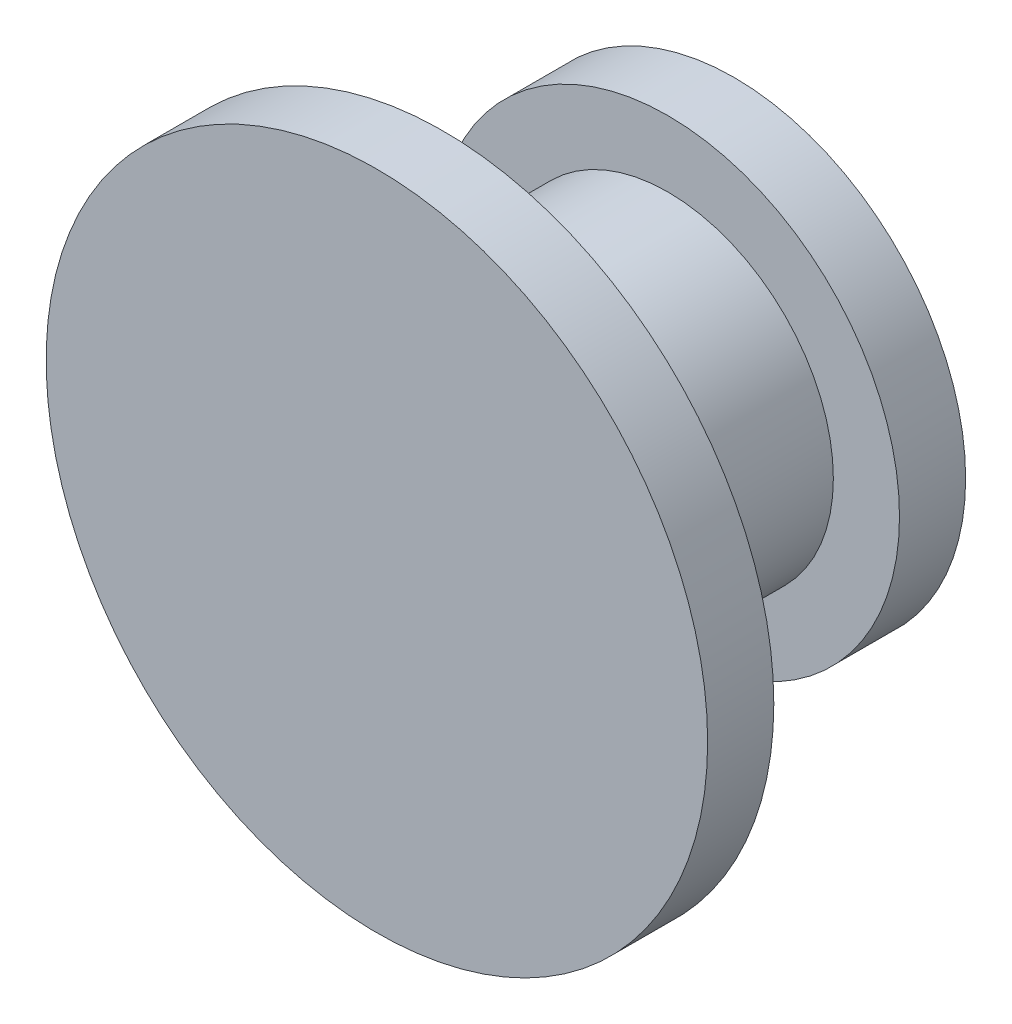
ISO-10303-21;
HEADER;
FILE_DESCRIPTION(('STEP AP214'),'2;1');
FILE_NAME('part.step','',(''),(''),'','','');
FILE_SCHEMA(('AUTOMOTIVE_DESIGN { 1 0 10303 214 1 1 1 1 }'));
ENDSEC;
DATA;
#1=APPLICATION_CONTEXT('core data for automotive mechanical design processes');
#2=APPLICATION_PROTOCOL_DEFINITION('international standard','automotive_design',2000,#1);
#3=PRODUCT_CONTEXT('',#1,'mechanical');
#4=PRODUCT('Part','Part','',(#3));
#5=PRODUCT_RELATED_PRODUCT_CATEGORY('part','',(#4));
#6=PRODUCT_DEFINITION_FORMATION('','',#4);
#7=PRODUCT_DEFINITION_CONTEXT('part definition',#1,'design');
#8=PRODUCT_DEFINITION('design','',#6,#7);
#9=PRODUCT_DEFINITION_SHAPE('','',#8);
#10=(LENGTH_UNIT() NAMED_UNIT(*) SI_UNIT(.MILLI.,.METRE.));
#11=(NAMED_UNIT(*) PLANE_ANGLE_UNIT() SI_UNIT($,.RADIAN.));
#12=(NAMED_UNIT(*) SI_UNIT($,.STERADIAN.) SOLID_ANGLE_UNIT());
#13=UNCERTAINTY_MEASURE_WITH_UNIT(LENGTH_MEASURE(1.E-05),#10,'distance_accuracy_value','');
#14=(GEOMETRIC_REPRESENTATION_CONTEXT(3) GLOBAL_UNCERTAINTY_ASSIGNED_CONTEXT((#13)) GLOBAL_UNIT_ASSIGNED_CONTEXT((#10,
#11,#12)) REPRESENTATION_CONTEXT('',''));
#15=CARTESIAN_POINT('',(0.,0.,0.));
#16=DIRECTION('',(0.,0.,1.));
#17=DIRECTION('',(1.,0.,0.));
#18=AXIS2_PLACEMENT_3D('',#15,#16,#17);
#19=CARTESIAN_POINT('',(0.,0.,-10.4710678118655));
#20=DIRECTION('',(0.,0.,1.));
#21=DIRECTION('',(1.,0.,0.));
#22=AXIS2_PLACEMENT_3D('',#19,#20,#21);
#23=CYLINDRICAL_SURFACE('',#22,2.5);
#24=CARTESIAN_POINT('',(0.,0.,0.));
#25=DIRECTION('',(0.,0.,1.));
#26=DIRECTION('',(1.,0.,0.));
#27=AXIS2_PLACEMENT_3D('',#24,#25,#26);
#28=CIRCLE('',#27,2.5);
#29=CARTESIAN_POINT('',(2.5,0.,0.));
#30=VERTEX_POINT('',#29);
#31=EDGE_CURVE('E10',#30,#30,#28,.T.);
#32=ORIENTED_EDGE('',*,*,#31,.F.);
#33=EDGE_LOOP('',(#32));
#34=FACE_BOUND('',#33,.T.);
#35=CARTESIAN_POINT('',(0.,0.,-3.4));
#36=DIRECTION('',(0.,0.,-1.));
#37=DIRECTION('',(-1.,0.,0.));
#38=AXIS2_PLACEMENT_3D('',#35,#36,#37);
#39=CIRCLE('',#38,2.5);
#40=CARTESIAN_POINT('',(-2.5,0.,-3.4));
#41=VERTEX_POINT('',#40);
#42=EDGE_CURVE('E33',#41,#41,#39,.F.);
#43=ORIENTED_EDGE('',*,*,#42,.T.);
#44=EDGE_LOOP('',(#43));
#45=FACE_BOUND('',#44,.T.);
#46=ADVANCED_FACE('F30',(#34,#45),#23,.T.);
#47=CARTESIAN_POINT('',(0.,0.,-4.4));
#48=DIRECTION('',(0.,0.,1.));
#49=DIRECTION('',(1.,0.,0.));
#50=AXIS2_PLACEMENT_3D('',#47,#48,#49);
#51=CYLINDRICAL_SURFACE('',#50,3.5);
#52=CARTESIAN_POINT('',(0.,0.,-4.4));
#53=DIRECTION('',(0.,0.,-1.));
#54=DIRECTION('',(-1.,0.,0.));
#55=AXIS2_PLACEMENT_3D('',#52,#53,#54);
#56=CIRCLE('',#55,3.5);
#57=CARTESIAN_POINT('',(-3.5,0.,-4.4));
#58=VERTEX_POINT('',#57);
#59=EDGE_CURVE('E40',#58,#58,#56,.T.);
#60=ORIENTED_EDGE('',*,*,#59,.F.);
#61=EDGE_LOOP('',(#60));
#62=FACE_BOUND('',#61,.T.);
#63=CARTESIAN_POINT('',(0.,0.,-3.4));
#64=DIRECTION('',(0.,0.,-1.));
#65=DIRECTION('',(-1.,0.,0.));
#66=AXIS2_PLACEMENT_3D('',#63,#64,#65);
#67=CIRCLE('',#66,3.5);
#68=CARTESIAN_POINT('',(-3.5,0.,-3.4));
#69=VERTEX_POINT('',#68);
#70=EDGE_CURVE('E42',#69,#69,#67,.T.);
#71=ORIENTED_EDGE('',*,*,#70,.T.);
#72=EDGE_LOOP('',(#71));
#73=FACE_BOUND('',#72,.T.);
#74=ADVANCED_FACE('F71',(#62,#73),#51,.T.);
#75=CARTESIAN_POINT('',(0.,0.,-4.4));
#76=DIRECTION('',(0.,0.,-1.));
#77=DIRECTION('',(-1.,0.,0.));
#78=AXIS2_PLACEMENT_3D('',#75,#76,#77);
#79=PLANE('',#78);
#80=ORIENTED_EDGE('',*,*,#59,.T.);
#81=EDGE_LOOP('',(#80));
#82=FACE_BOUND('',#81,.T.);
#83=ADVANCED_FACE('F76',(#82),#79,.T.);
#84=CARTESIAN_POINT('',(0.,0.,-3.4));
#85=DIRECTION('',(0.,0.,-1.));
#86=DIRECTION('',(-1.,0.,0.));
#87=AXIS2_PLACEMENT_3D('',#84,#85,#86);
#88=PLANE('',#87);
#89=ORIENTED_EDGE('',*,*,#42,.F.);
#90=EDGE_LOOP('',(#89));
#91=FACE_BOUND('',#90,.T.);
#92=ORIENTED_EDGE('',*,*,#70,.F.);
#93=EDGE_LOOP('',(#92));
#94=FACE_BOUND('',#93,.T.);
#95=ADVANCED_FACE('F59',(#91,#94),#88,.F.);
#96=CARTESIAN_POINT('',(0.,0.,1.));
#97=DIRECTION('',(0.,0.,-1.));
#98=DIRECTION('',(-1.,0.,0.));
#99=AXIS2_PLACEMENT_3D('',#96,#97,#98);
#100=CYLINDRICAL_SURFACE('',#99,5.);
#101=CARTESIAN_POINT('',(0.,0.,1.));
#102=DIRECTION('',(0.,0.,1.));
#103=DIRECTION('',(1.,0.,0.));
#104=AXIS2_PLACEMENT_3D('',#101,#102,#103);
#105=CIRCLE('',#104,5.);
#106=CARTESIAN_POINT('',(5.,0.,1.));
#107=VERTEX_POINT('',#106);
#108=EDGE_CURVE('E45',#107,#107,#105,.T.);
#109=ORIENTED_EDGE('',*,*,#108,.F.);
#110=EDGE_LOOP('',(#109));
#111=FACE_BOUND('',#110,.T.);
#112=CARTESIAN_POINT('',(0.,0.,0.));
#113=DIRECTION('',(0.,0.,1.));
#114=DIRECTION('',(1.,0.,0.));
#115=AXIS2_PLACEMENT_3D('',#112,#113,#114);
#116=CIRCLE('',#115,5.);
#117=CARTESIAN_POINT('',(5.,0.,0.));
#118=VERTEX_POINT('',#117);
#119=EDGE_CURVE('E48',#118,#118,#116,.T.);
#120=ORIENTED_EDGE('',*,*,#119,.T.);
#121=EDGE_LOOP('',(#120));
#122=FACE_BOUND('',#121,.T.);
#123=ADVANCED_FACE('F56',(#111,#122),#100,.T.);
#124=CARTESIAN_POINT('',(0.,0.,1.));
#125=DIRECTION('',(0.,0.,1.));
#126=DIRECTION('',(1.,0.,0.));
#127=AXIS2_PLACEMENT_3D('',#124,#125,#126);
#128=PLANE('',#127);
#129=ORIENTED_EDGE('',*,*,#108,.T.);
#130=EDGE_LOOP('',(#129));
#131=FACE_BOUND('',#130,.T.);
#132=ADVANCED_FACE('F54',(#131),#128,.T.);
#133=CARTESIAN_POINT('',(0.,0.,0.));
#134=DIRECTION('',(0.,0.,1.));
#135=DIRECTION('',(1.,0.,0.));
#136=AXIS2_PLACEMENT_3D('',#133,#134,#135);
#137=PLANE('',#136);
#138=ORIENTED_EDGE('',*,*,#31,.T.);
#139=EDGE_LOOP('',(#138));
#140=FACE_BOUND('',#139,.T.);
#141=ORIENTED_EDGE('',*,*,#119,.F.);
#142=EDGE_LOOP('',(#141));
#143=FACE_BOUND('',#142,.T.);
#144=ADVANCED_FACE('F63',(#140,#143),#137,.F.);
#145=CLOSED_SHELL('',(#46,#74,#83,#95,#123,#132,#144));
#146=MANIFOLD_SOLID_BREP('B2',#145);
#147=ADVANCED_BREP_SHAPE_REPRESENTATION('',(#18,#146),#14);
#148=SHAPE_DEFINITION_REPRESENTATION(#9,#147);
ENDSEC;
END-ISO-10303-21;
